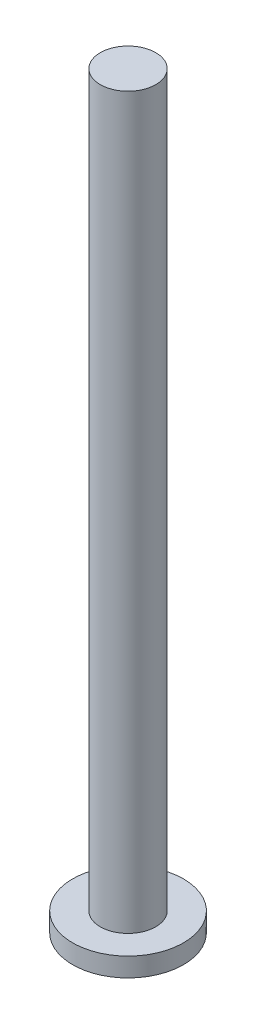
ISO-10303-21;
HEADER;
FILE_DESCRIPTION(('STEP AP214'),'2;1');
FILE_NAME('part.step','',(''),(''),'','','');
FILE_SCHEMA(('AUTOMOTIVE_DESIGN { 1 0 10303 214 1 1 1 1 }'));
ENDSEC;
DATA;
#1=APPLICATION_CONTEXT('core data for automotive mechanical design processes');
#2=APPLICATION_PROTOCOL_DEFINITION('international standard','automotive_design',2000,#1);
#3=PRODUCT_CONTEXT('',#1,'mechanical');
#4=PRODUCT('Part','Part','',(#3));
#5=PRODUCT_RELATED_PRODUCT_CATEGORY('part','',(#4));
#6=PRODUCT_DEFINITION_FORMATION('','',#4);
#7=PRODUCT_DEFINITION_CONTEXT('part definition',#1,'design');
#8=PRODUCT_DEFINITION('design','',#6,#7);
#9=PRODUCT_DEFINITION_SHAPE('','',#8);
#10=(LENGTH_UNIT() NAMED_UNIT(*) SI_UNIT(.MILLI.,.METRE.));
#11=(NAMED_UNIT(*) PLANE_ANGLE_UNIT() SI_UNIT($,.RADIAN.));
#12=(NAMED_UNIT(*) SI_UNIT($,.STERADIAN.) SOLID_ANGLE_UNIT());
#13=UNCERTAINTY_MEASURE_WITH_UNIT(LENGTH_MEASURE(1.E-05),#10,'distance_accuracy_value','');
#14=(GEOMETRIC_REPRESENTATION_CONTEXT(3) GLOBAL_UNCERTAINTY_ASSIGNED_CONTEXT((#13)) GLOBAL_UNIT_ASSIGNED_CONTEXT((#10,
#11,#12)) REPRESENTATION_CONTEXT('',''));
#15=CARTESIAN_POINT('',(0.,0.,0.));
#16=DIRECTION('',(0.,0.,1.));
#17=DIRECTION('',(1.,0.,0.));
#18=AXIS2_PLACEMENT_3D('',#15,#16,#17);
#19=CARTESIAN_POINT('',(0.,3.302,0.));
#20=DIRECTION('',(0.,-1.,0.));
#21=DIRECTION('',(0.,0.,-1.));
#22=AXIS2_PLACEMENT_3D('',#19,#20,#21);
#23=CYLINDRICAL_SURFACE('',#22,9.652);
#24=CARTESIAN_POINT('',(0.,3.302,0.));
#25=DIRECTION('',(0.,1.,0.));
#26=DIRECTION('',(0.,0.,1.));
#27=AXIS2_PLACEMENT_3D('',#24,#25,#26);
#28=CIRCLE('',#27,9.652);
#29=CARTESIAN_POINT('',(0.,3.302,-9.652));
#30=VERTEX_POINT('',#29);
#31=EDGE_CURVE('E10',#30,#30,#28,.T.);
#32=CARTESIAN_POINT('',(0.,0.,0.));
#33=DIRECTION('',(0.,1.,0.));
#34=DIRECTION('',(0.,0.,1.));
#35=AXIS2_PLACEMENT_3D('',#32,#33,#34);
#36=CIRCLE('',#35,9.652);
#37=CARTESIAN_POINT('',(0.,0.,-9.652));
#38=VERTEX_POINT('',#37);
#39=EDGE_CURVE('E34',#38,#38,#36,.T.);
#40=CARTESIAN_POINT('',(0.,3.302,-9.652));
#41=CARTESIAN_POINT('',(0.,3.26760416666667,-9.652));
#42=CARTESIAN_POINT('',(0.,3.23320833333333,-9.652));
#43=CARTESIAN_POINT('',(0.,3.16441666666667,-9.652));
#44=CARTESIAN_POINT('',(0.,3.13002083333333,-9.652));
#45=CARTESIAN_POINT('',(0.,3.06122916666667,-9.652));
#46=CARTESIAN_POINT('',(0.,3.02683333333333,-9.652));
#47=CARTESIAN_POINT('',(0.,2.95804166666667,-9.652));
#48=CARTESIAN_POINT('',(0.,2.92364583333333,-9.652));
#49=CARTESIAN_POINT('',(0.,2.85485416666667,-9.652));
#50=CARTESIAN_POINT('',(0.,2.82045833333333,-9.652));
#51=CARTESIAN_POINT('',(0.,2.75166666666667,-9.652));
#52=CARTESIAN_POINT('',(0.,2.71727083333333,-9.652));
#53=CARTESIAN_POINT('',(0.,2.64847916666667,-9.652));
#54=CARTESIAN_POINT('',(0.,2.61408333333333,-9.652));
#55=CARTESIAN_POINT('',(0.,2.54529166666667,-9.652));
#56=CARTESIAN_POINT('',(0.,2.51089583333333,-9.652));
#57=CARTESIAN_POINT('',(0.,2.44210416666667,-9.652));
#58=CARTESIAN_POINT('',(0.,2.40770833333333,-9.652));
#59=CARTESIAN_POINT('',(0.,2.33891666666667,-9.652));
#60=CARTESIAN_POINT('',(0.,2.30452083333333,-9.652));
#61=CARTESIAN_POINT('',(0.,2.23572916666667,-9.652));
#62=CARTESIAN_POINT('',(0.,2.20133333333333,-9.652));
#63=CARTESIAN_POINT('',(0.,2.13254166666667,-9.652));
#64=CARTESIAN_POINT('',(0.,2.09814583333333,-9.652));
#65=CARTESIAN_POINT('',(0.,2.02935416666667,-9.652));
#66=CARTESIAN_POINT('',(0.,1.99495833333333,-9.652));
#67=CARTESIAN_POINT('',(0.,1.92616666666667,-9.652));
#68=CARTESIAN_POINT('',(0.,1.89177083333333,-9.652));
#69=CARTESIAN_POINT('',(0.,1.82297916666667,-9.652));
#70=CARTESIAN_POINT('',(0.,1.78858333333333,-9.652));
#71=CARTESIAN_POINT('',(0.,1.71979166666667,-9.652));
#72=CARTESIAN_POINT('',(0.,1.68539583333333,-9.652));
#73=CARTESIAN_POINT('',(0.,1.61660416666667,-9.652));
#74=CARTESIAN_POINT('',(0.,1.58220833333333,-9.652));
#75=CARTESIAN_POINT('',(0.,1.51341666666667,-9.652));
#76=CARTESIAN_POINT('',(0.,1.47902083333333,-9.652));
#77=CARTESIAN_POINT('',(0.,1.41022916666667,-9.652));
#78=CARTESIAN_POINT('',(0.,1.37583333333333,-9.652));
#79=CARTESIAN_POINT('',(0.,1.30704166666667,-9.652));
#80=CARTESIAN_POINT('',(0.,1.27264583333333,-9.652));
#81=CARTESIAN_POINT('',(0.,1.20385416666667,-9.652));
#82=CARTESIAN_POINT('',(0.,1.16945833333333,-9.652));
#83=CARTESIAN_POINT('',(0.,1.10066666666667,-9.652));
#84=CARTESIAN_POINT('',(0.,1.06627083333333,-9.652));
#85=CARTESIAN_POINT('',(0.,0.997479166666666,-9.652));
#86=CARTESIAN_POINT('',(0.,0.963083333333333,-9.652));
#87=CARTESIAN_POINT('',(0.,0.894291666666666,-9.652));
#88=CARTESIAN_POINT('',(0.,0.859895833333333,-9.652));
#89=CARTESIAN_POINT('',(0.,0.791104166666666,-9.652));
#90=CARTESIAN_POINT('',(0.,0.756708333333333,-9.652));
#91=CARTESIAN_POINT('',(0.,0.687916666666667,-9.652));
#92=CARTESIAN_POINT('',(0.,0.653520833333333,-9.652));
#93=CARTESIAN_POINT('',(0.,0.584729166666667,-9.652));
#94=CARTESIAN_POINT('',(0.,0.550333333333333,-9.652));
#95=CARTESIAN_POINT('',(0.,0.481541666666667,-9.652));
#96=CARTESIAN_POINT('',(0.,0.447145833333333,-9.652));
#97=CARTESIAN_POINT('',(0.,0.378354166666667,-9.652));
#98=CARTESIAN_POINT('',(0.,0.343958333333333,-9.652));
#99=CARTESIAN_POINT('',(0.,0.275166666666667,-9.652));
#100=CARTESIAN_POINT('',(0.,0.240770833333333,-9.652));
#101=CARTESIAN_POINT('',(0.,0.171979166666667,-9.652));
#102=CARTESIAN_POINT('',(0.,0.137583333333333,-9.652));
#103=CARTESIAN_POINT('',(0.,0.0687916666666666,-9.652));
#104=CARTESIAN_POINT('',(0.,0.0343958333333333,-9.652));
#105=CARTESIAN_POINT('',(0.,0.,-9.652));
#106=B_SPLINE_CURVE_WITH_KNOTS('',3,(#40,#41,#42,#43,#44,#45,#46,#47,#48,#49,#50,#51,#52,#53,
#54,#55,#56,#57,#58,#59,#60,#61,#62,#63,#64,#65,#66,#67,#68,#69,#70,#71,#72,#73,#74,#75,#76,#77,
#78,#79,#80,#81,#82,#83,#84,#85,#86,#87,#88,#89,#90,#91,#92,#93,#94,#95,#96,#97,#98,#99,#100,
#101,#102,#103,#104,#105),.UNSPECIFIED.,.F.,.F.,(4,2,2,2,2,2,2,2,2,2,2,2,2,2,2,2,2,2,2,2,2,2,2,
2,2,2,2,2,2,2,2,2,4),(0.,0.1031875,0.206375,0.3095625,0.41275,0.5159375,0.619125,0.7223125,
0.8255,0.9286875,1.031875,1.1350625,1.23825,1.3414375,1.444625,1.5478125,1.651,1.7541875,
1.857375,1.9605625,2.06375,2.1669375,2.270125,2.3733125,2.4765,2.5796875,2.682875,2.7860625,
2.88925,2.9924375,3.095625,3.1988125,3.302),.UNSPECIFIED.);
#107=EDGE_CURVE('BSEAM31',#30,#38,#106,.T.);
#108=ORIENTED_EDGE('',*,*,#31,.F.);
#109=ORIENTED_EDGE('',*,*,#39,.T.);
#110=ORIENTED_EDGE('',*,*,#107,.T.);
#111=ORIENTED_EDGE('',*,*,#107,.F.);
#112=EDGE_LOOP('',(#108,#110,#109,#111));
#113=FACE_BOUND('',#112,.T.);
#114=ADVANCED_FACE('F31',(#113),#23,.T.);
#115=CARTESIAN_POINT('',(0.,3.302,0.));
#116=DIRECTION('',(0.,1.,0.));
#117=DIRECTION('',(0.,0.,1.));
#118=AXIS2_PLACEMENT_3D('',#115,#116,#117);
#119=PLANE('',#118);
#120=CARTESIAN_POINT('',(0.,3.302,0.));
#121=DIRECTION('',(0.,1.,0.));
#122=DIRECTION('',(0.,0.,1.));
#123=AXIS2_PLACEMENT_3D('',#120,#121,#122);
#124=CIRCLE('',#123,4.826);
#125=CARTESIAN_POINT('',(0.,3.302,4.826));
#126=VERTEX_POINT('',#125);
#127=EDGE_CURVE('E41',#126,#126,#124,.F.);
#128=ORIENTED_EDGE('',*,*,#127,.T.);
#129=EDGE_LOOP('',(#128));
#130=FACE_BOUND('',#129,.T.);
#131=ORIENTED_EDGE('',*,*,#31,.T.);
#132=EDGE_LOOP('',(#131));
#133=FACE_BOUND('',#132,.T.);
#134=ADVANCED_FACE('F67',(#130,#133),#119,.T.);
#135=CARTESIAN_POINT('',(0.,0.,0.));
#136=DIRECTION('',(0.,1.,0.));
#137=DIRECTION('',(0.,0.,1.));
#138=AXIS2_PLACEMENT_3D('',#135,#136,#137);
#139=PLANE('',#138);
#140=CARTESIAN_POINT('',(0.,0.,0.));
#141=DIRECTION('',(0.,1.,0.));
#142=DIRECTION('',(0.,0.,1.));
#143=AXIS2_PLACEMENT_3D('',#140,#141,#142);
#144=CIRCLE('',#143,3.302);
#145=CARTESIAN_POINT('',(0.,0.,3.302));
#146=VERTEX_POINT('',#145);
#147=EDGE_CURVE('E49',#146,#146,#144,.T.);
#148=ORIENTED_EDGE('',*,*,#147,.T.);
#149=EDGE_LOOP('',(#148));
#150=FACE_BOUND('',#149,.T.);
#151=ORIENTED_EDGE('',*,*,#39,.F.);
#152=EDGE_LOOP('',(#151));
#153=FACE_BOUND('',#152,.T.);
#154=ADVANCED_FACE('F72',(#150,#153),#139,.F.);
#155=CARTESIAN_POINT('',(0.,130.302,0.));
#156=DIRECTION('',(0.,-1.,0.));
#157=DIRECTION('',(0.,0.,-1.));
#158=AXIS2_PLACEMENT_3D('',#155,#156,#157);
#159=CYLINDRICAL_SURFACE('',#158,4.826);
#160=ORIENTED_EDGE('',*,*,#127,.F.);
#161=EDGE_LOOP('',(#160));
#162=FACE_BOUND('',#161,.T.);
#163=CARTESIAN_POINT('',(0.,130.302,0.));
#164=DIRECTION('',(0.,1.,0.));
#165=DIRECTION('',(0.,0.,1.));
#166=AXIS2_PLACEMENT_3D('',#163,#164,#165);
#167=CIRCLE('',#166,4.826);
#168=CARTESIAN_POINT('',(0.,130.302,4.826));
#169=VERTEX_POINT('',#168);
#170=EDGE_CURVE('E45',#169,#169,#167,.T.);
#171=ORIENTED_EDGE('',*,*,#170,.F.);
#172=EDGE_LOOP('',(#171));
#173=FACE_BOUND('',#172,.T.);
#174=ADVANCED_FACE('F79',(#162,#173),#159,.T.);
#175=CARTESIAN_POINT('',(0.,130.302,0.));
#176=DIRECTION('',(0.,1.,0.));
#177=DIRECTION('',(0.,0.,1.));
#178=AXIS2_PLACEMENT_3D('',#175,#176,#177);
#179=PLANE('',#178);
#180=ORIENTED_EDGE('',*,*,#170,.T.);
#181=EDGE_LOOP('',(#180));
#182=FACE_BOUND('',#181,.T.);
#183=ADVANCED_FACE('F64',(#182),#179,.T.);
#184=CARTESIAN_POINT('',(0.,127.,0.));
#185=DIRECTION('',(0.,-1.,0.));
#186=DIRECTION('',(0.,0.,-1.));
#187=AXIS2_PLACEMENT_3D('',#184,#185,#186);
#188=CYLINDRICAL_SURFACE('',#187,3.302);
#189=CARTESIAN_POINT('',(0.,127.,0.));
#190=DIRECTION('',(0.,1.,0.));
#191=DIRECTION('',(0.,0.,1.));
#192=AXIS2_PLACEMENT_3D('',#189,#190,#191);
#193=CIRCLE('',#192,3.302);
#194=CARTESIAN_POINT('',(0.,127.,3.302));
#195=VERTEX_POINT('',#194);
#196=EDGE_CURVE('E48',#195,#195,#193,.T.);
#197=ORIENTED_EDGE('',*,*,#196,.T.);
#198=EDGE_LOOP('',(#197));
#199=FACE_BOUND('',#198,.T.);
#200=ORIENTED_EDGE('',*,*,#147,.F.);
#201=EDGE_LOOP('',(#200));
#202=FACE_BOUND('',#201,.T.);
#203=ADVANCED_FACE('F55',(#199,#202),#188,.F.);
#204=CARTESIAN_POINT('',(0.,127.,0.));
#205=DIRECTION('',(0.,1.,0.));
#206=DIRECTION('',(0.,0.,1.));
#207=AXIS2_PLACEMENT_3D('',#204,#205,#206);
#208=PLANE('',#207);
#209=ORIENTED_EDGE('',*,*,#196,.F.);
#210=EDGE_LOOP('',(#209));
#211=FACE_BOUND('',#210,.T.);
#212=ADVANCED_FACE('F58',(#211),#208,.F.);
#213=CLOSED_SHELL('',(#114,#134,#154,#174,#183,#203,#212));
#214=MANIFOLD_SOLID_BREP('B2',#213);
#215=ADVANCED_BREP_SHAPE_REPRESENTATION('',(#18,#214),#14);
#216=SHAPE_DEFINITION_REPRESENTATION(#9,#215);
ENDSEC;
END-ISO-10303-21;
